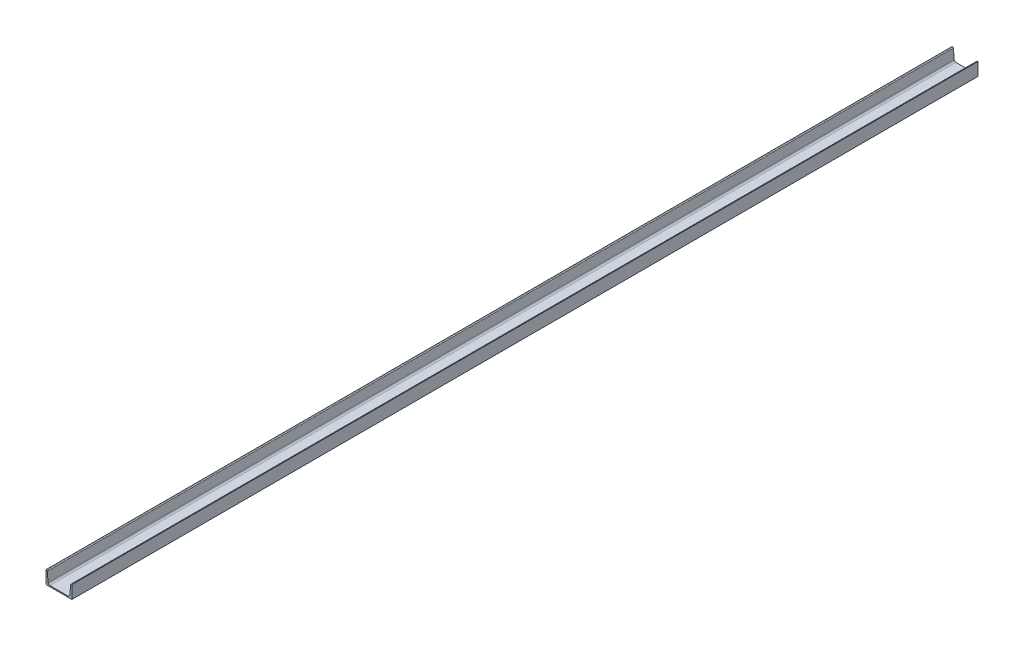
ISO-10303-21;
HEADER;
FILE_DESCRIPTION(('STEP AP214'),'2;1');
FILE_NAME('part.step','',(''),(''),'','','');
FILE_SCHEMA(('AUTOMOTIVE_DESIGN { 1 0 10303 214 1 1 1 1 }'));
ENDSEC;
DATA;
#1=APPLICATION_CONTEXT('core data for automotive mechanical design processes');
#2=APPLICATION_PROTOCOL_DEFINITION('international standard','automotive_design',2000,#1);
#3=PRODUCT_CONTEXT('',#1,'mechanical');
#4=PRODUCT('Part','Part','',(#3));
#5=PRODUCT_RELATED_PRODUCT_CATEGORY('part','',(#4));
#6=PRODUCT_DEFINITION_FORMATION('','',#4);
#7=PRODUCT_DEFINITION_CONTEXT('part definition',#1,'design');
#8=PRODUCT_DEFINITION('design','',#6,#7);
#9=PRODUCT_DEFINITION_SHAPE('','',#8);
#10=(LENGTH_UNIT() NAMED_UNIT(*) SI_UNIT(.MILLI.,.METRE.));
#11=(NAMED_UNIT(*) PLANE_ANGLE_UNIT() SI_UNIT($,.RADIAN.));
#12=(NAMED_UNIT(*) SI_UNIT($,.STERADIAN.) SOLID_ANGLE_UNIT());
#13=UNCERTAINTY_MEASURE_WITH_UNIT(LENGTH_MEASURE(1.E-05),#10,'distance_accuracy_value','');
#14=(GEOMETRIC_REPRESENTATION_CONTEXT(3) GLOBAL_UNCERTAINTY_ASSIGNED_CONTEXT((#13)) GLOBAL_UNIT_ASSIGNED_CONTEXT((#10,
#11,#12)) REPRESENTATION_CONTEXT('',''));
#15=CARTESIAN_POINT('',(0.,0.,0.));
#16=DIRECTION('',(0.,0.,1.));
#17=DIRECTION('',(1.,0.,0.));
#18=AXIS2_PLACEMENT_3D('',#15,#16,#17);
#19=CARTESIAN_POINT('',(147.57814259585,70.,-5250.));
#20=DIRECTION('',(0.,0.,1.));
#21=DIRECTION('',(1.,0.,0.));
#22=AXIS2_PLACEMENT_3D('',#19,#20,#21);
#23=CYLINDRICAL_SURFACE('',#22,5.00000000000001);
#24=CARTESIAN_POINT('',(147.57814259585,70.,0.));
#25=DIRECTION('',(0.,0.,-1.));
#26=DIRECTION('',(-1.,0.,0.));
#27=AXIS2_PLACEMENT_3D('',#24,#25,#26);
#28=CIRCLE('',#27,5.00000000000001);
#29=CARTESIAN_POINT('',(142.597169105391,70.4357787137382,0.));
#30=VERTEX_POINT('',#29);
#31=CARTESIAN_POINT('',(147.57814259585,75.,0.));
#32=VERTEX_POINT('',#31);
#33=EDGE_CURVE('E202',#30,#32,#28,.T.);
#34=ORIENTED_EDGE('',*,*,#33,.T.);
#35=DIRECTION('',(0.,0.,1.));
#36=VECTOR('',#35,1.);
#37=CARTESIAN_POINT('',(147.57814259585,75.,-5250.));
#38=LINE('',#37,#36);
#39=CARTESIAN_POINT('',(147.57814259585,75.,-5250.));
#40=VERTEX_POINT('',#39);
#41=EDGE_CURVE('E13',#40,#32,#38,.T.);
#42=ORIENTED_EDGE('',*,*,#41,.F.);
#43=CARTESIAN_POINT('',(147.57814259585,70.,-5250.));
#44=DIRECTION('',(0.,0.,-1.));
#45=DIRECTION('',(-1.,0.,0.));
#46=AXIS2_PLACEMENT_3D('',#43,#44,#45);
#47=CIRCLE('',#46,5.00000000000001);
#48=CARTESIAN_POINT('',(142.597169105391,70.4357787137382,-5250.));
#49=VERTEX_POINT('',#48);
#50=EDGE_CURVE('E224',#49,#40,#47,.T.);
#51=ORIENTED_EDGE('',*,*,#50,.F.);
#52=DIRECTION('',(0.,0.,1.));
#53=VECTOR('',#52,1.);
#54=CARTESIAN_POINT('',(142.597169105391,70.4357787137382,-5250.));
#55=LINE('',#54,#53);
#56=EDGE_CURVE('E198',#49,#30,#55,.T.);
#57=ORIENTED_EDGE('',*,*,#56,.T.);
#58=EDGE_LOOP('',(#34,#42,#51,#57));
#59=FACE_BOUND('',#58,.T.);
#60=ADVANCED_FACE('F82',(#59),#23,.T.);
#61=CARTESIAN_POINT('',(150.,75.,-5250.));
#62=DIRECTION('',(0.,-1.,0.));
#63=DIRECTION('',(0.,0.,-1.));
#64=AXIS2_PLACEMENT_3D('',#61,#62,#63);
#65=PLANE('',#64);
#66=DIRECTION('',(1.,0.,0.));
#67=VECTOR('',#66,1.);
#68=CARTESIAN_POINT('',(150.,75.,0.));
#69=LINE('',#68,#67);
#70=CARTESIAN_POINT('',(150.,75.,0.));
#71=VERTEX_POINT('',#70);
#72=EDGE_CURVE('E205',#32,#71,#69,.T.);
#73=ORIENTED_EDGE('',*,*,#72,.T.);
#74=DIRECTION('',(0.,0.,1.));
#75=VECTOR('',#74,1.);
#76=CARTESIAN_POINT('',(150.,75.,-5250.));
#77=LINE('',#76,#75);
#78=CARTESIAN_POINT('',(150.,75.,-5250.));
#79=VERTEX_POINT('',#78);
#80=EDGE_CURVE('E90',#79,#71,#77,.T.);
#81=ORIENTED_EDGE('',*,*,#80,.F.);
#82=DIRECTION('',(1.,0.,0.));
#83=VECTOR('',#82,1.);
#84=CARTESIAN_POINT('',(150.,75.,-5250.));
#85=LINE('',#84,#83);
#86=EDGE_CURVE('E153',#40,#79,#85,.T.);
#87=ORIENTED_EDGE('',*,*,#86,.F.);
#88=ORIENTED_EDGE('',*,*,#41,.T.);
#89=EDGE_LOOP('',(#73,#81,#87,#88));
#90=FACE_BOUND('',#89,.T.);
#91=ADVANCED_FACE('F302',(#90),#65,.F.);
#92=CARTESIAN_POINT('',(150.,75.,-5250.));
#93=DIRECTION('',(-1.,0.,0.));
#94=DIRECTION('',(0.,0.,1.));
#95=AXIS2_PLACEMENT_3D('',#92,#93,#94);
#96=PLANE('',#95);
#97=DIRECTION('',(0.,-1.,0.));
#98=VECTOR('',#97,1.);
#99=CARTESIAN_POINT('',(150.,75.,0.));
#100=LINE('',#99,#98);
#101=CARTESIAN_POINT('',(150.,0.,0.));
#102=VERTEX_POINT('',#101);
#103=EDGE_CURVE('E207',#71,#102,#100,.T.);
#104=ORIENTED_EDGE('',*,*,#103,.T.);
#105=DIRECTION('',(0.,0.,1.));
#106=VECTOR('',#105,1.);
#107=CARTESIAN_POINT('',(150.,0.,-5250.));
#108=LINE('',#107,#106);
#109=CARTESIAN_POINT('',(150.,0.,-5250.));
#110=VERTEX_POINT('',#109);
#111=EDGE_CURVE('E243',#110,#102,#108,.T.);
#112=ORIENTED_EDGE('',*,*,#111,.F.);
#113=DIRECTION('',(0.,-1.,0.));
#114=VECTOR('',#113,1.);
#115=CARTESIAN_POINT('',(150.,75.,-5250.));
#116=LINE('',#115,#114);
#117=EDGE_CURVE('E251',#79,#110,#116,.T.);
#118=ORIENTED_EDGE('',*,*,#117,.F.);
#119=ORIENTED_EDGE('',*,*,#80,.T.);
#120=EDGE_LOOP('',(#104,#112,#118,#119));
#121=FACE_BOUND('',#120,.T.);
#122=ADVANCED_FACE('F249',(#121),#96,.F.);
#123=CARTESIAN_POINT('',(150.,0.,-5250.));
#124=DIRECTION('',(0.,1.,0.));
#125=DIRECTION('',(0.,0.,1.));
#126=AXIS2_PLACEMENT_3D('',#123,#124,#125);
#127=PLANE('',#126);
#128=DIRECTION('',(-1.,0.,0.));
#129=VECTOR('',#128,1.);
#130=CARTESIAN_POINT('',(150.,0.,0.));
#131=LINE('',#130,#129);
#132=CARTESIAN_POINT('',(0.,0.,0.));
#133=VERTEX_POINT('',#132);
#134=EDGE_CURVE('E209',#102,#133,#131,.T.);
#135=ORIENTED_EDGE('',*,*,#134,.T.);
#136=DIRECTION('',(0.,0.,1.));
#137=VECTOR('',#136,1.);
#138=CARTESIAN_POINT('',(0.,0.,-5250.));
#139=LINE('',#138,#137);
#140=CARTESIAN_POINT('',(0.,0.,-5250.));
#141=VERTEX_POINT('',#140);
#142=EDGE_CURVE('E240',#141,#133,#139,.T.);
#143=ORIENTED_EDGE('',*,*,#142,.F.);
#144=DIRECTION('',(-1.,0.,0.));
#145=VECTOR('',#144,1.);
#146=CARTESIAN_POINT('',(150.,0.,-5250.));
#147=LINE('',#146,#145);
#148=EDGE_CURVE('E269',#110,#141,#147,.T.);
#149=ORIENTED_EDGE('',*,*,#148,.F.);
#150=ORIENTED_EDGE('',*,*,#111,.T.);
#151=EDGE_LOOP('',(#135,#143,#149,#150));
#152=FACE_BOUND('',#151,.T.);
#153=ADVANCED_FACE('F260',(#152),#127,.F.);
#154=CARTESIAN_POINT('',(0.,75.,-5250.));
#155=DIRECTION('',(1.,0.,0.));
#156=DIRECTION('',(0.,1.,0.));
#157=AXIS2_PLACEMENT_3D('',#154,#155,#156);
#158=PLANE('',#157);
#159=DIRECTION('',(0.,1.,0.));
#160=VECTOR('',#159,1.);
#161=CARTESIAN_POINT('',(0.,75.,0.));
#162=LINE('',#161,#160);
#163=CARTESIAN_POINT('',(0.,75.,0.));
#164=VERTEX_POINT('',#163);
#165=EDGE_CURVE('E211',#133,#164,#162,.T.);
#166=ORIENTED_EDGE('',*,*,#165,.T.);
#167=DIRECTION('',(0.,0.,1.));
#168=VECTOR('',#167,1.);
#169=CARTESIAN_POINT('',(0.,75.,-5250.));
#170=LINE('',#169,#168);
#171=CARTESIAN_POINT('',(0.,75.,-5250.));
#172=VERTEX_POINT('',#171);
#173=EDGE_CURVE('E237',#172,#164,#170,.T.);
#174=ORIENTED_EDGE('',*,*,#173,.F.);
#175=DIRECTION('',(0.,1.,0.));
#176=VECTOR('',#175,1.);
#177=CARTESIAN_POINT('',(0.,75.,-5250.));
#178=LINE('',#177,#176);
#179=EDGE_CURVE('E266',#141,#172,#178,.T.);
#180=ORIENTED_EDGE('',*,*,#179,.F.);
#181=ORIENTED_EDGE('',*,*,#142,.T.);
#182=EDGE_LOOP('',(#166,#174,#180,#181));
#183=FACE_BOUND('',#182,.T.);
#184=ADVANCED_FACE('F264',(#183),#158,.F.);
#185=CARTESIAN_POINT('',(0.,75.,-5250.));
#186=DIRECTION('',(0.,-1.,0.));
#187=DIRECTION('',(0.,0.,-1.));
#188=AXIS2_PLACEMENT_3D('',#185,#186,#187);
#189=PLANE('',#188);
#190=DIRECTION('',(1.,0.,0.));
#191=VECTOR('',#190,1.);
#192=CARTESIAN_POINT('',(0.,75.,0.));
#193=LINE('',#192,#191);
#194=CARTESIAN_POINT('',(2.42185740415011,75.,0.));
#195=VERTEX_POINT('',#194);
#196=EDGE_CURVE('E213',#164,#195,#193,.T.);
#197=ORIENTED_EDGE('',*,*,#196,.T.);
#198=DIRECTION('',(0.,0.,1.));
#199=VECTOR('',#198,1.);
#200=CARTESIAN_POINT('',(2.42185740415011,75.,-5250.));
#201=LINE('',#200,#199);
#202=CARTESIAN_POINT('',(2.42185740415011,75.,-5250.));
#203=VERTEX_POINT('',#202);
#204=EDGE_CURVE('E234',#203,#195,#201,.T.);
#205=ORIENTED_EDGE('',*,*,#204,.F.);
#206=DIRECTION('',(1.,0.,0.));
#207=VECTOR('',#206,1.);
#208=CARTESIAN_POINT('',(0.,75.,-5250.));
#209=LINE('',#208,#207);
#210=EDGE_CURVE('E268',#172,#203,#209,.T.);
#211=ORIENTED_EDGE('',*,*,#210,.F.);
#212=ORIENTED_EDGE('',*,*,#173,.T.);
#213=EDGE_LOOP('',(#197,#205,#211,#212));
#214=FACE_BOUND('',#213,.T.);
#215=ADVANCED_FACE('F315',(#214),#189,.F.);
#216=CARTESIAN_POINT('',(2.42185740415011,70.,-5250.));
#217=DIRECTION('',(0.,0.,1.));
#218=DIRECTION('',(1.,0.,0.));
#219=AXIS2_PLACEMENT_3D('',#216,#217,#218);
#220=CYLINDRICAL_SURFACE('',#219,4.99999999999999);
#221=CARTESIAN_POINT('',(2.42185740415011,70.,0.));
#222=DIRECTION('',(0.,0.,-1.));
#223=DIRECTION('',(1.,0.,0.));
#224=AXIS2_PLACEMENT_3D('',#221,#222,#223);
#225=CIRCLE('',#224,4.99999999999999);
#226=CARTESIAN_POINT('',(7.40283089460884,70.4357787137383,0.));
#227=VERTEX_POINT('',#226);
#228=EDGE_CURVE('E215',#195,#227,#225,.T.);
#229=ORIENTED_EDGE('',*,*,#228,.T.);
#230=DIRECTION('',(0.,0.,1.));
#231=VECTOR('',#230,1.);
#232=CARTESIAN_POINT('',(7.40283089460884,70.4357787137383,-5250.));
#233=LINE('',#232,#231);
#234=CARTESIAN_POINT('',(7.40283089460884,70.4357787137383,-5250.));
#235=VERTEX_POINT('',#234);
#236=EDGE_CURVE('E231',#235,#227,#233,.T.);
#237=ORIENTED_EDGE('',*,*,#236,.F.);
#238=CARTESIAN_POINT('',(2.42185740415011,70.,-5250.));
#239=DIRECTION('',(0.,0.,-1.));
#240=DIRECTION('',(1.,0.,0.));
#241=AXIS2_PLACEMENT_3D('',#238,#239,#240);
#242=CIRCLE('',#241,4.99999999999999);
#243=EDGE_CURVE('E271',#203,#235,#242,.T.);
#244=ORIENTED_EDGE('',*,*,#243,.F.);
#245=ORIENTED_EDGE('',*,*,#204,.T.);
#246=EDGE_LOOP('',(#229,#237,#244,#245));
#247=FACE_BOUND('',#246,.T.);
#248=ADVANCED_FACE('F318',(#247),#220,.T.);
#249=CARTESIAN_POINT('',(12.1978514850195,15.6284425725235,-5250.));
#250=DIRECTION('',(-0.996194698091746,-0.087155742747653,0.));
#251=DIRECTION('',(0.087155742747653,-0.996194698091746,0.));
#252=AXIS2_PLACEMENT_3D('',#249,#250,#251);
#253=PLANE('',#252);
#254=DIRECTION('',(0.087155742747653,-0.996194698091746,0.));
#255=VECTOR('',#254,1.);
#256=CARTESIAN_POINT('',(12.1978514850195,15.6284425725235,0.));
#257=LINE('',#256,#255);
#258=CARTESIAN_POINT('',(12.1978514850195,15.6284425725235,0.));
#259=VERTEX_POINT('',#258);
#260=EDGE_CURVE('E217',#227,#259,#257,.T.);
#261=ORIENTED_EDGE('',*,*,#260,.T.);
#262=DIRECTION('',(0.,0.,1.));
#263=VECTOR('',#262,1.);
#264=CARTESIAN_POINT('',(12.1978514850195,15.6284425725235,-5250.));
#265=LINE('',#264,#263);
#266=CARTESIAN_POINT('',(12.1978514850195,15.6284425725235,-5250.));
#267=VERTEX_POINT('',#266);
#268=EDGE_CURVE('E228',#267,#259,#265,.T.);
#269=ORIENTED_EDGE('',*,*,#268,.F.);
#270=DIRECTION('',(0.087155742747653,-0.996194698091746,0.));
#271=VECTOR('',#270,1.);
#272=CARTESIAN_POINT('',(12.1978514850195,15.6284425725235,-5250.));
#273=LINE('',#272,#271);
#274=EDGE_CURVE('E277',#235,#267,#273,.T.);
#275=ORIENTED_EDGE('',*,*,#274,.F.);
#276=ORIENTED_EDGE('',*,*,#236,.T.);
#277=EDGE_LOOP('',(#261,#269,#275,#276));
#278=FACE_BOUND('',#277,.T.);
#279=ADVANCED_FACE('F283',(#278),#253,.F.);
#280=CARTESIAN_POINT('',(22.159798465937,16.5,-5250.));
#281=DIRECTION('',(0.,0.,1.));
#282=DIRECTION('',(1.,0.,0.));
#283=AXIS2_PLACEMENT_3D('',#280,#281,#282);
#284=CYLINDRICAL_SURFACE('',#283,10.);
#285=CARTESIAN_POINT('',(22.159798465937,16.5,0.));
#286=DIRECTION('',(0.,0.,1.));
#287=DIRECTION('',(-1.,0.,0.));
#288=AXIS2_PLACEMENT_3D('',#285,#286,#287);
#289=CIRCLE('',#288,10.);
#290=CARTESIAN_POINT('',(22.159798465937,6.50000000000005,0.));
#291=VERTEX_POINT('',#290);
#292=EDGE_CURVE('E219',#259,#291,#289,.T.);
#293=ORIENTED_EDGE('',*,*,#292,.T.);
#294=DIRECTION('',(0.,0.,1.));
#295=VECTOR('',#294,1.);
#296=CARTESIAN_POINT('',(22.159798465937,6.50000000000005,-5250.));
#297=LINE('',#296,#295);
#298=CARTESIAN_POINT('',(22.159798465937,6.50000000000005,-5250.));
#299=VERTEX_POINT('',#298);
#300=EDGE_CURVE('E193',#299,#291,#297,.T.);
#301=ORIENTED_EDGE('',*,*,#300,.F.);
#302=CARTESIAN_POINT('',(22.159798465937,16.5,-5250.));
#303=DIRECTION('',(0.,0.,1.));
#304=DIRECTION('',(-1.,0.,0.));
#305=AXIS2_PLACEMENT_3D('',#302,#303,#304);
#306=CIRCLE('',#305,10.);
#307=EDGE_CURVE('E184',#267,#299,#306,.T.);
#308=ORIENTED_EDGE('',*,*,#307,.F.);
#309=ORIENTED_EDGE('',*,*,#268,.T.);
#310=EDGE_LOOP('',(#293,#301,#308,#309));
#311=FACE_BOUND('',#310,.T.);
#312=ADVANCED_FACE('F287',(#311),#284,.F.);
#313=CARTESIAN_POINT('',(127.840201534063,6.50000000000002,-5250.));
#314=DIRECTION('',(0.,-1.,0.));
#315=DIRECTION('',(1.,0.,0.));
#316=AXIS2_PLACEMENT_3D('',#313,#314,#315);
#317=PLANE('',#316);
#318=DIRECTION('',(1.,0.,0.));
#319=VECTOR('',#318,1.);
#320=CARTESIAN_POINT('',(127.840201534063,6.50000000000002,0.));
#321=LINE('',#320,#319);
#322=CARTESIAN_POINT('',(127.840201534063,6.50000000000001,0.));
#323=VERTEX_POINT('',#322);
#324=EDGE_CURVE('E192',#291,#323,#321,.T.);
#325=ORIENTED_EDGE('',*,*,#324,.T.);
#326=DIRECTION('',(0.,0.,1.));
#327=VECTOR('',#326,1.);
#328=CARTESIAN_POINT('',(127.840201534063,6.50000000000001,-5250.));
#329=LINE('',#328,#327);
#330=CARTESIAN_POINT('',(127.840201534063,6.50000000000001,-5250.));
#331=VERTEX_POINT('',#330);
#332=EDGE_CURVE('E189',#331,#323,#329,.T.);
#333=ORIENTED_EDGE('',*,*,#332,.F.);
#334=DIRECTION('',(1.,0.,0.));
#335=VECTOR('',#334,1.);
#336=CARTESIAN_POINT('',(127.840201534063,6.50000000000002,-5250.));
#337=LINE('',#336,#335);
#338=EDGE_CURVE('E178',#299,#331,#337,.T.);
#339=ORIENTED_EDGE('',*,*,#338,.F.);
#340=ORIENTED_EDGE('',*,*,#300,.T.);
#341=EDGE_LOOP('',(#325,#333,#339,#340));
#342=FACE_BOUND('',#341,.T.);
#343=ADVANCED_FACE('F190',(#342),#317,.F.);
#344=CARTESIAN_POINT('',(127.840201534063,16.5,-5250.));
#345=DIRECTION('',(0.,0.,1.));
#346=DIRECTION('',(1.,0.,0.));
#347=AXIS2_PLACEMENT_3D('',#344,#345,#346);
#348=CYLINDRICAL_SURFACE('',#347,9.99999999999999);
#349=CARTESIAN_POINT('',(127.840201534063,16.5,0.));
#350=DIRECTION('',(0.,0.,1.));
#351=DIRECTION('',(1.,0.,0.));
#352=AXIS2_PLACEMENT_3D('',#349,#350,#351);
#353=CIRCLE('',#352,9.99999999999999);
#354=CARTESIAN_POINT('',(137.802148514981,15.6284425725235,0.));
#355=VERTEX_POINT('',#354);
#356=EDGE_CURVE('E139',#323,#355,#353,.T.);
#357=ORIENTED_EDGE('',*,*,#356,.T.);
#358=DIRECTION('',(0.,0.,1.));
#359=VECTOR('',#358,1.);
#360=CARTESIAN_POINT('',(137.802148514981,15.6284425725235,-5250.));
#361=LINE('',#360,#359);
#362=CARTESIAN_POINT('',(137.802148514981,15.6284425725235,-5250.));
#363=VERTEX_POINT('',#362);
#364=EDGE_CURVE('E194',#363,#355,#361,.T.);
#365=ORIENTED_EDGE('',*,*,#364,.F.);
#366=CARTESIAN_POINT('',(127.840201534063,16.5,-5250.));
#367=DIRECTION('',(0.,0.,1.));
#368=DIRECTION('',(1.,0.,0.));
#369=AXIS2_PLACEMENT_3D('',#366,#367,#368);
#370=CIRCLE('',#369,9.99999999999999);
#371=EDGE_CURVE('E182',#331,#363,#370,.T.);
#372=ORIENTED_EDGE('',*,*,#371,.F.);
#373=ORIENTED_EDGE('',*,*,#332,.T.);
#374=EDGE_LOOP('',(#357,#365,#372,#373));
#375=FACE_BOUND('',#374,.T.);
#376=ADVANCED_FACE('F196',(#375),#348,.F.);
#377=CARTESIAN_POINT('',(137.802148514981,15.6284425725235,-5250.));
#378=DIRECTION('',(0.996194698091746,-0.0871557427476512,0.));
#379=DIRECTION('',(0.0871557427476512,0.996194698091746,0.));
#380=AXIS2_PLACEMENT_3D('',#377,#378,#379);
#381=PLANE('',#380);
#382=DIRECTION('',(0.0871557427476512,0.996194698091746,0.));
#383=VECTOR('',#382,1.);
#384=CARTESIAN_POINT('',(137.802148514981,15.6284425725235,0.));
#385=LINE('',#384,#383);
#386=EDGE_CURVE('E145',#355,#30,#385,.T.);
#387=ORIENTED_EDGE('',*,*,#386,.T.);
#388=ORIENTED_EDGE('',*,*,#56,.F.);
#389=DIRECTION('',(0.0871557427476512,0.996194698091746,0.));
#390=VECTOR('',#389,1.);
#391=CARTESIAN_POINT('',(137.802148514981,15.6284425725235,-5250.));
#392=LINE('',#391,#390);
#393=EDGE_CURVE('E98',#363,#49,#392,.T.);
#394=ORIENTED_EDGE('',*,*,#393,.F.);
#395=ORIENTED_EDGE('',*,*,#364,.T.);
#396=EDGE_LOOP('',(#387,#388,#394,#395));
#397=FACE_BOUND('',#396,.T.);
#398=ADVANCED_FACE('F291',(#397),#381,.F.);
#399=CARTESIAN_POINT('',(147.57814259585,70.,-5250.));
#400=DIRECTION('',(0.,0.,-1.));
#401=DIRECTION('',(-1.,0.,0.));
#402=AXIS2_PLACEMENT_3D('',#399,#400,#401);
#403=PLANE('',#402);
#404=ORIENTED_EDGE('',*,*,#50,.T.);
#405=ORIENTED_EDGE('',*,*,#86,.T.);
#406=ORIENTED_EDGE('',*,*,#117,.T.);
#407=ORIENTED_EDGE('',*,*,#148,.T.);
#408=ORIENTED_EDGE('',*,*,#179,.T.);
#409=ORIENTED_EDGE('',*,*,#210,.T.);
#410=ORIENTED_EDGE('',*,*,#243,.T.);
#411=ORIENTED_EDGE('',*,*,#274,.T.);
#412=ORIENTED_EDGE('',*,*,#307,.T.);
#413=ORIENTED_EDGE('',*,*,#338,.T.);
#414=ORIENTED_EDGE('',*,*,#371,.T.);
#415=ORIENTED_EDGE('',*,*,#393,.T.);
#416=EDGE_LOOP('',(#404,#405,#406,#407,#408,#409,#410,#411,#412,#413,#414,#415));
#417=FACE_BOUND('',#416,.T.);
#418=ADVANCED_FACE('F180',(#417),#403,.T.);
#419=CARTESIAN_POINT('',(147.57814259585,70.,0.));
#420=DIRECTION('',(0.,0.,-1.));
#421=DIRECTION('',(-1.,0.,0.));
#422=AXIS2_PLACEMENT_3D('',#419,#420,#421);
#423=PLANE('',#422);
#424=ORIENTED_EDGE('',*,*,#33,.F.);
#425=ORIENTED_EDGE('',*,*,#386,.F.);
#426=ORIENTED_EDGE('',*,*,#356,.F.);
#427=ORIENTED_EDGE('',*,*,#324,.F.);
#428=ORIENTED_EDGE('',*,*,#292,.F.);
#429=ORIENTED_EDGE('',*,*,#260,.F.);
#430=ORIENTED_EDGE('',*,*,#228,.F.);
#431=ORIENTED_EDGE('',*,*,#196,.F.);
#432=ORIENTED_EDGE('',*,*,#165,.F.);
#433=ORIENTED_EDGE('',*,*,#134,.F.);
#434=ORIENTED_EDGE('',*,*,#103,.F.);
#435=ORIENTED_EDGE('',*,*,#72,.F.);
#436=EDGE_LOOP('',(#424,#425,#426,#427,#428,#429,#430,#431,#432,#433,#434,#435));
#437=FACE_BOUND('',#436,.T.);
#438=ADVANCED_FACE('F255',(#437),#423,.F.);
#439=CLOSED_SHELL('',(#60,#91,#122,#153,#184,#215,#248,#279,#312,#343,#376,#398,#418,#438));
#440=MANIFOLD_SOLID_BREP('B2',#439);
#441=ADVANCED_BREP_SHAPE_REPRESENTATION('',(#18,#440),#14);
#442=SHAPE_DEFINITION_REPRESENTATION(#9,#441);
ENDSEC;
END-ISO-10303-21;
